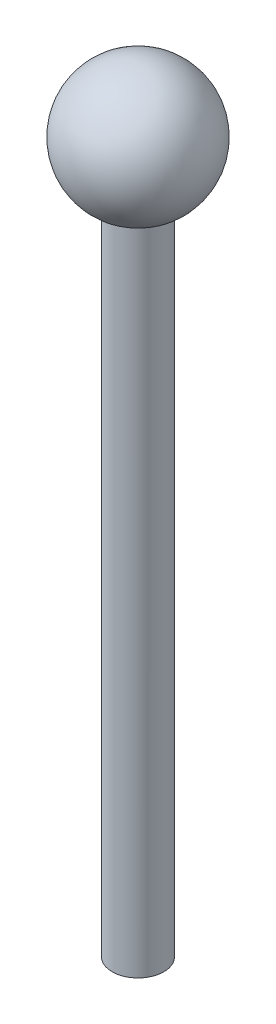
ISO-10303-21;
HEADER;
FILE_DESCRIPTION(('STEP AP214'),'2;1');
FILE_NAME('part.step','',(''),(''),'','','');
FILE_SCHEMA(('AUTOMOTIVE_DESIGN { 1 0 10303 214 1 1 1 1 }'));
ENDSEC;
DATA;
#1=APPLICATION_CONTEXT('core data for automotive mechanical design processes');
#2=APPLICATION_PROTOCOL_DEFINITION('international standard','automotive_design',2000,#1);
#3=PRODUCT_CONTEXT('',#1,'mechanical');
#4=PRODUCT('Part','Part','',(#3));
#5=PRODUCT_RELATED_PRODUCT_CATEGORY('part','',(#4));
#6=PRODUCT_DEFINITION_FORMATION('','',#4);
#7=PRODUCT_DEFINITION_CONTEXT('part definition',#1,'design');
#8=PRODUCT_DEFINITION('design','',#6,#7);
#9=PRODUCT_DEFINITION_SHAPE('','',#8);
#10=(LENGTH_UNIT() NAMED_UNIT(*) SI_UNIT(.MILLI.,.METRE.));
#11=(NAMED_UNIT(*) PLANE_ANGLE_UNIT() SI_UNIT($,.RADIAN.));
#12=(NAMED_UNIT(*) SI_UNIT($,.STERADIAN.) SOLID_ANGLE_UNIT());
#13=UNCERTAINTY_MEASURE_WITH_UNIT(LENGTH_MEASURE(1.E-05),#10,'distance_accuracy_value','');
#14=(GEOMETRIC_REPRESENTATION_CONTEXT(3) GLOBAL_UNCERTAINTY_ASSIGNED_CONTEXT((#13)) GLOBAL_UNIT_ASSIGNED_CONTEXT((#10,
#11,#12)) REPRESENTATION_CONTEXT('',''));
#15=CARTESIAN_POINT('',(0.,0.,0.));
#16=DIRECTION('',(0.,0.,1.));
#17=DIRECTION('',(1.,0.,0.));
#18=AXIS2_PLACEMENT_3D('',#15,#16,#17);
#19=CARTESIAN_POINT('',(0.,55.,0.));
#20=DIRECTION('',(0.,-1.,0.));
#21=DIRECTION('',(1.,0.,0.));
#22=AXIS2_PLACEMENT_3D('',#19,#20,#21);
#23=SPHERICAL_SURFACE('',#22,5.);
#24=CARTESIAN_POINT('',(0.,50.4174243050442,0.));
#25=DIRECTION('',(0.,-1.,0.));
#26=DIRECTION('',(0.,0.,-1.));
#27=AXIS2_PLACEMENT_3D('',#24,#25,#26);
#28=CIRCLE('',#27,2.);
#29=CARTESIAN_POINT('',(0.,50.4174243050442,-2.));
#30=VERTEX_POINT('',#29);
#31=EDGE_CURVE('E10',#30,#30,#28,.T.);
#32=ORIENTED_EDGE('',*,*,#31,.F.);
#33=EDGE_LOOP('',(#32));
#34=FACE_BOUND('',#33,.T.);
#35=ADVANCED_FACE('F47',(#34),#23,.T.);
#36=CARTESIAN_POINT('',(0.,0.,0.));
#37=DIRECTION('',(0.,-1.,0.));
#38=DIRECTION('',(0.,0.,-1.));
#39=AXIS2_PLACEMENT_3D('',#36,#37,#38);
#40=CYLINDRICAL_SURFACE('',#39,2.);
#41=CARTESIAN_POINT('',(0.,0.,0.));
#42=DIRECTION('',(0.,-1.,0.));
#43=DIRECTION('',(0.,0.,-1.));
#44=AXIS2_PLACEMENT_3D('',#41,#42,#43);
#45=CIRCLE('',#44,2.);
#46=CARTESIAN_POINT('',(0.,0.,-2.));
#47=VERTEX_POINT('',#46);
#48=EDGE_CURVE('E54',#47,#47,#45,.T.);
#49=ORIENTED_EDGE('',*,*,#48,.F.);
#50=EDGE_LOOP('',(#49));
#51=FACE_BOUND('',#50,.T.);
#52=ORIENTED_EDGE('',*,*,#31,.T.);
#53=EDGE_LOOP('',(#52));
#54=FACE_BOUND('',#53,.T.);
#55=ADVANCED_FACE('F63',(#51,#54),#40,.T.);
#56=CARTESIAN_POINT('',(0.,0.,0.));
#57=DIRECTION('',(0.,1.,0.));
#58=DIRECTION('',(0.,0.,1.));
#59=AXIS2_PLACEMENT_3D('',#56,#57,#58);
#60=PLANE('',#59);
#61=ORIENTED_EDGE('',*,*,#48,.T.);
#62=EDGE_LOOP('',(#61));
#63=FACE_BOUND('',#62,.T.);
#64=ADVANCED_FACE('F61',(#63),#60,.F.);
#65=CLOSED_SHELL('',(#35,#55,#64));
#66=MANIFOLD_SOLID_BREP('B2',#65);
#67=ADVANCED_BREP_SHAPE_REPRESENTATION('',(#18,#66),#14);
#68=SHAPE_DEFINITION_REPRESENTATION(#9,#67);
ENDSEC;
END-ISO-10303-21;
